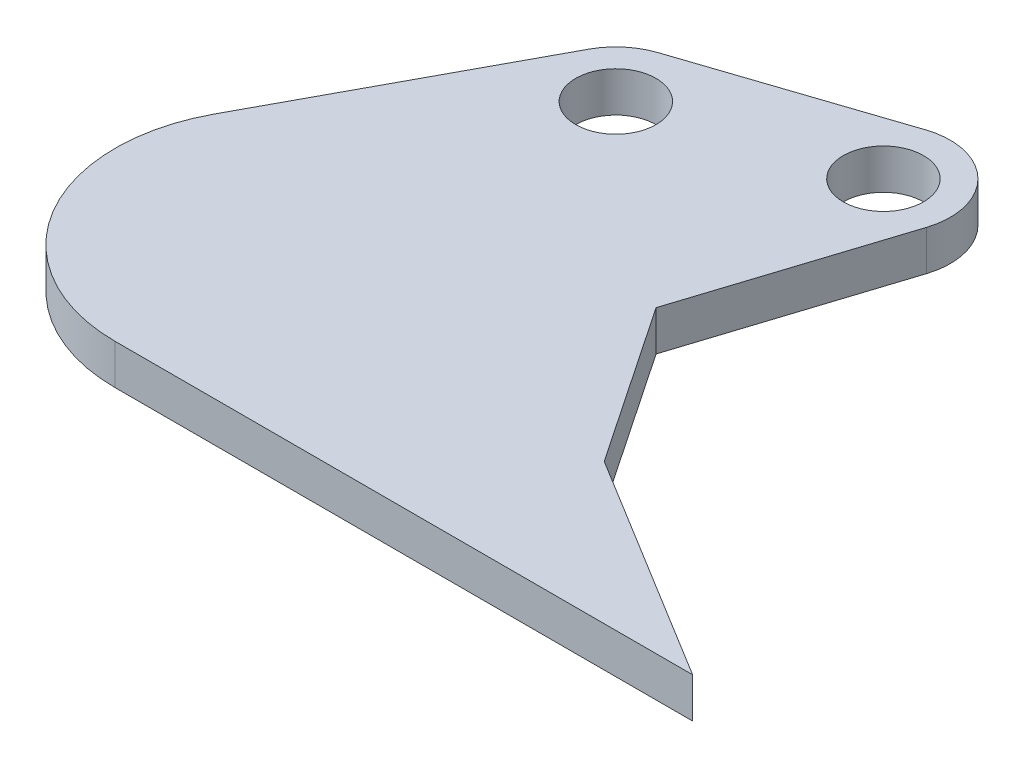
ISO-10303-21;
HEADER;
FILE_DESCRIPTION(('STEP AP214'),'2;1');
FILE_NAME('part.step','',(''),(''),'','','');
FILE_SCHEMA(('AUTOMOTIVE_DESIGN { 1 0 10303 214 1 1 1 1 }'));
ENDSEC;
DATA;
#1=APPLICATION_CONTEXT('core data for automotive mechanical design processes');
#2=APPLICATION_PROTOCOL_DEFINITION('international standard','automotive_design',2000,#1);
#3=PRODUCT_CONTEXT('',#1,'mechanical');
#4=PRODUCT('Part','Part','',(#3));
#5=PRODUCT_RELATED_PRODUCT_CATEGORY('part','',(#4));
#6=PRODUCT_DEFINITION_FORMATION('','',#4);
#7=PRODUCT_DEFINITION_CONTEXT('part definition',#1,'design');
#8=PRODUCT_DEFINITION('design','',#6,#7);
#9=PRODUCT_DEFINITION_SHAPE('','',#8);
#10=(LENGTH_UNIT() NAMED_UNIT(*) SI_UNIT(.MILLI.,.METRE.));
#11=(NAMED_UNIT(*) PLANE_ANGLE_UNIT() SI_UNIT($,.RADIAN.));
#12=(NAMED_UNIT(*) SI_UNIT($,.STERADIAN.) SOLID_ANGLE_UNIT());
#13=UNCERTAINTY_MEASURE_WITH_UNIT(LENGTH_MEASURE(1.E-05),#10,'distance_accuracy_value','');
#14=(GEOMETRIC_REPRESENTATION_CONTEXT(3) GLOBAL_UNCERTAINTY_ASSIGNED_CONTEXT((#13)) GLOBAL_UNIT_ASSIGNED_CONTEXT((#10,
#11,#12)) REPRESENTATION_CONTEXT('',''));
#15=CARTESIAN_POINT('',(0.,0.,0.));
#16=DIRECTION('',(0.,0.,1.));
#17=DIRECTION('',(1.,0.,0.));
#18=AXIS2_PLACEMENT_3D('',#15,#16,#17);
#19=CARTESIAN_POINT('',(-13.9441350903988,3.,-7.50787566868559));
#20=DIRECTION('',(0.880484404238511,0.,0.474075114188411));
#21=DIRECTION('',(0.474075114188411,0.,-0.880484404238511));
#22=AXIS2_PLACEMENT_3D('',#19,#20,#21);
#23=PLANE('',#22);
#24=DIRECTION('',(-0.474075114188411,0.,0.880484404238511));
#25=VECTOR('',#24,1.);
#26=CARTESIAN_POINT('',(-13.9441350903988,0.,-7.50787566868559));
#27=LINE('',#26,#25);
#28=CARTESIAN_POINT('',(-19.4024220211926,0.,2.62962442905794));
#29=VERTEX_POINT('',#28);
#30=CARTESIAN_POINT('',(-29.1939319779369,0.,20.8150797563611));
#31=VERTEX_POINT('',#30);
#32=EDGE_CURVE('E150',#29,#31,#27,.T.);
#33=ORIENTED_EDGE('',*,*,#32,.T.);
#34=DIRECTION('',(0.,-1.,0.));
#35=VECTOR('',#34,1.);
#36=CARTESIAN_POINT('',(-29.1939319779369,3.,20.8150797563611));
#37=LINE('',#36,#35);
#38=CARTESIAN_POINT('',(-29.1939319779369,3.,20.8150797563611));
#39=VERTEX_POINT('',#38);
#40=EDGE_CURVE('E11',#39,#31,#37,.T.);
#41=ORIENTED_EDGE('',*,*,#40,.F.);
#42=DIRECTION('',(-0.474075114188411,0.,0.880484404238511));
#43=VECTOR('',#42,1.);
#44=CARTESIAN_POINT('',(-13.9441350903988,3.,-7.50787566868559));
#45=LINE('',#44,#43);
#46=CARTESIAN_POINT('',(-19.4024220211926,3.,2.62962442905794));
#47=VERTEX_POINT('',#46);
#48=EDGE_CURVE('E176',#47,#39,#45,.T.);
#49=ORIENTED_EDGE('',*,*,#48,.F.);
#50=DIRECTION('',(0.,-1.,0.));
#51=VECTOR('',#50,1.);
#52=CARTESIAN_POINT('',(-19.4024220211926,3.,2.62962442905794));
#53=LINE('',#52,#51);
#54=EDGE_CURVE('E149',#47,#29,#53,.T.);
#55=ORIENTED_EDGE('',*,*,#54,.T.);
#56=EDGE_LOOP('',(#33,#41,#49,#55));
#57=FACE_BOUND('',#56,.T.);
#58=ADVANCED_FACE('F41',(#57),#23,.F.);
#59=CARTESIAN_POINT('',(-18.1878769249555,3.,26.7410186837162));
#60=DIRECTION('',(0.,-1.,0.));
#61=DIRECTION('',(0.,0.,-1.));
#62=AXIS2_PLACEMENT_3D('',#59,#60,#61);
#63=CYLINDRICAL_SURFACE('',#62,12.5);
#64=CARTESIAN_POINT('',(-18.1878769249555,0.,26.7410186837162));
#65=DIRECTION('',(0.,1.,0.));
#66=DIRECTION('',(0.,0.,1.));
#67=AXIS2_PLACEMENT_3D('',#64,#65,#66);
#68=CIRCLE('',#67,12.5);
#69=CARTESIAN_POINT('',(-18.1878769249555,0.,39.2410186837162));
#70=VERTEX_POINT('',#69);
#71=EDGE_CURVE('E153',#31,#70,#68,.T.);
#72=ORIENTED_EDGE('',*,*,#71,.T.);
#73=DIRECTION('',(0.,-1.,0.));
#74=VECTOR('',#73,1.);
#75=CARTESIAN_POINT('',(-18.1878769249555,3.,39.2410186837162));
#76=LINE('',#75,#74);
#77=CARTESIAN_POINT('',(-18.1878769249555,3.,39.2410186837162));
#78=VERTEX_POINT('',#77);
#79=EDGE_CURVE('E49',#78,#70,#76,.T.);
#80=ORIENTED_EDGE('',*,*,#79,.F.);
#81=CARTESIAN_POINT('',(-18.1878769249555,3.,26.7410186837162));
#82=DIRECTION('',(0.,1.,0.));
#83=DIRECTION('',(0.,0.,1.));
#84=AXIS2_PLACEMENT_3D('',#81,#82,#83);
#85=CIRCLE('',#84,12.5);
#86=EDGE_CURVE('E99',#39,#78,#85,.T.);
#87=ORIENTED_EDGE('',*,*,#86,.F.);
#88=ORIENTED_EDGE('',*,*,#40,.T.);
#89=EDGE_LOOP('',(#72,#80,#87,#88));
#90=FACE_BOUND('',#89,.T.);
#91=ADVANCED_FACE('F214',(#90),#63,.T.);
#92=CARTESIAN_POINT('',(0.,3.,39.2410186837162));
#93=DIRECTION('',(0.,0.,-1.));
#94=DIRECTION('',(-1.,0.,0.));
#95=AXIS2_PLACEMENT_3D('',#92,#93,#94);
#96=PLANE('',#95);
#97=DIRECTION('',(1.,0.,0.));
#98=VECTOR('',#97,1.);
#99=CARTESIAN_POINT('',(0.,0.,39.2410186837162));
#100=LINE('',#99,#98);
#101=CARTESIAN_POINT('',(24.9805666171507,0.,39.2410186837162));
#102=VERTEX_POINT('',#101);
#103=EDGE_CURVE('E155',#70,#102,#100,.T.);
#104=ORIENTED_EDGE('',*,*,#103,.T.);
#105=DIRECTION('',(0.,-1.,0.));
#106=VECTOR('',#105,1.);
#107=CARTESIAN_POINT('',(24.9805666171507,3.,39.2410186837162));
#108=LINE('',#107,#106);
#109=CARTESIAN_POINT('',(24.9805666171507,3.,39.2410186837162));
#110=VERTEX_POINT('',#109);
#111=EDGE_CURVE('E184',#110,#102,#108,.T.);
#112=ORIENTED_EDGE('',*,*,#111,.F.);
#113=DIRECTION('',(1.,0.,0.));
#114=VECTOR('',#113,1.);
#115=CARTESIAN_POINT('',(0.,3.,39.2410186837162));
#116=LINE('',#115,#114);
#117=EDGE_CURVE('E191',#78,#110,#116,.T.);
#118=ORIENTED_EDGE('',*,*,#117,.F.);
#119=ORIENTED_EDGE('',*,*,#79,.T.);
#120=EDGE_LOOP('',(#104,#112,#118,#119));
#121=FACE_BOUND('',#120,.T.);
#122=ADVANCED_FACE('F189',(#121),#96,.F.);
#123=CARTESIAN_POINT('',(-10.6586922843376,3.,17.3629679887185));
#124=DIRECTION('',(0.523163964597966,0.,-0.85223204947135));
#125=DIRECTION('',(-0.85223204947135,0.,-0.523163964597966));
#126=AXIS2_PLACEMENT_3D('',#123,#124,#125);
#127=PLANE('',#126);
#128=DIRECTION('',(0.85223204947135,0.,0.523163964597966));
#129=VECTOR('',#128,1.);
#130=CARTESIAN_POINT('',(-10.6586922843376,0.,17.3629679887185));
#131=LINE('',#130,#129);
#132=CARTESIAN_POINT('',(7.86365903530545,0.,28.7333767360448));
#133=VERTEX_POINT('',#132);
#134=EDGE_CURVE('E158',#133,#102,#131,.T.);
#135=ORIENTED_EDGE('',*,*,#134,.F.);
#136=DIRECTION('',(0.,-1.,0.));
#137=VECTOR('',#136,1.);
#138=CARTESIAN_POINT('',(7.86365903530545,3.,28.7333767360448));
#139=LINE('',#138,#137);
#140=CARTESIAN_POINT('',(7.86365903530545,3.,28.7333767360448));
#141=VERTEX_POINT('',#140);
#142=EDGE_CURVE('E182',#141,#133,#139,.T.);
#143=ORIENTED_EDGE('',*,*,#142,.F.);
#144=DIRECTION('',(0.85223204947135,0.,0.523163964597966));
#145=VECTOR('',#144,1.);
#146=CARTESIAN_POINT('',(-10.6586922843376,3.,17.3629679887185));
#147=LINE('',#146,#145);
#148=EDGE_CURVE('E203',#141,#110,#147,.T.);
#149=ORIENTED_EDGE('',*,*,#148,.T.);
#150=ORIENTED_EDGE('',*,*,#111,.T.);
#151=EDGE_LOOP('',(#135,#143,#149,#150));
#152=FACE_BOUND('',#151,.T.);
#153=ADVANCED_FACE('F200',(#152),#127,.T.);
#154=CARTESIAN_POINT('',(-7.90940999468469,3.,5.33086716399149));
#155=DIRECTION('',(0.829236661469017,0.,-0.558897628618801));
#156=DIRECTION('',(-0.558897628618801,0.,-0.829236661469017));
#157=AXIS2_PLACEMENT_3D('',#154,#155,#156);
#158=PLANE('',#157);
#159=DIRECTION('',(0.558897628618801,0.,0.829236661469017));
#160=VECTOR('',#159,1.);
#161=CARTESIAN_POINT('',(-7.90940999468469,0.,5.33086716399149));
#162=LINE('',#161,#160);
#163=CARTESIAN_POINT('',(-0.14994294070807,0.,16.8435919012923));
#164=VERTEX_POINT('',#163);
#165=EDGE_CURVE('E161',#164,#133,#162,.T.);
#166=ORIENTED_EDGE('',*,*,#165,.F.);
#167=DIRECTION('',(0.,-1.,0.));
#168=VECTOR('',#167,1.);
#169=CARTESIAN_POINT('',(-0.14994294070807,3.,16.8435919012923));
#170=LINE('',#169,#168);
#171=CARTESIAN_POINT('',(-0.14994294070807,3.,16.8435919012923));
#172=VERTEX_POINT('',#171);
#173=EDGE_CURVE('E180',#172,#164,#170,.T.);
#174=ORIENTED_EDGE('',*,*,#173,.F.);
#175=DIRECTION('',(0.558897628618801,0.,0.829236661469017));
#176=VECTOR('',#175,1.);
#177=CARTESIAN_POINT('',(-7.90940999468469,3.,5.33086716399149));
#178=LINE('',#177,#176);
#179=EDGE_CURVE('E205',#172,#141,#178,.T.);
#180=ORIENTED_EDGE('',*,*,#179,.T.);
#181=ORIENTED_EDGE('',*,*,#142,.T.);
#182=EDGE_LOOP('',(#166,#174,#180,#181));
#183=FACE_BOUND('',#182,.T.);
#184=ADVANCED_FACE('F224',(#183),#158,.T.);
#185=CARTESIAN_POINT('',(4.76123977347545,3.,1.52662890693038));
#186=DIRECTION('',(-0.95224795469509,0.,-0.305325781386075));
#187=DIRECTION('',(-0.305325781386075,0.,0.95224795469509));
#188=AXIS2_PLACEMENT_3D('',#185,#186,#187);
#189=PLANE('',#188);
#190=DIRECTION('',(0.305325781386075,0.,-0.95224795469509));
#191=VECTOR('',#190,1.);
#192=CARTESIAN_POINT('',(4.76123977347545,0.,1.52662890693038));
#193=LINE('',#192,#191);
#194=CARTESIAN_POINT('',(4.76123977347545,0.,1.52662890693038));
#195=VERTEX_POINT('',#194);
#196=EDGE_CURVE('E164',#164,#195,#193,.T.);
#197=ORIENTED_EDGE('',*,*,#196,.T.);
#198=DIRECTION('',(0.,-1.,0.));
#199=VECTOR('',#198,1.);
#200=CARTESIAN_POINT('',(4.76123977347545,3.,1.52662890693038));
#201=LINE('',#200,#199);
#202=CARTESIAN_POINT('',(4.76123977347545,3.,1.52662890693038));
#203=VERTEX_POINT('',#202);
#204=EDGE_CURVE('E136',#203,#195,#201,.T.);
#205=ORIENTED_EDGE('',*,*,#204,.F.);
#206=DIRECTION('',(0.305325781386075,0.,-0.95224795469509));
#207=VECTOR('',#206,1.);
#208=CARTESIAN_POINT('',(4.76123977347545,3.,1.52662890693038));
#209=LINE('',#208,#207);
#210=EDGE_CURVE('E123',#172,#203,#209,.T.);
#211=ORIENTED_EDGE('',*,*,#210,.F.);
#212=ORIENTED_EDGE('',*,*,#173,.T.);
#213=EDGE_LOOP('',(#197,#205,#211,#212));
#214=FACE_BOUND('',#213,.T.);
#215=ADVANCED_FACE('F227',(#214),#189,.F.);
#216=CARTESIAN_POINT('',(0.,3.,0.));
#217=DIRECTION('',(0.,-1.,0.));
#218=DIRECTION('',(0.,0.,-1.));
#219=AXIS2_PLACEMENT_3D('',#216,#217,#218);
#220=CYLINDRICAL_SURFACE('',#219,5.);
#221=CARTESIAN_POINT('',(0.,0.,0.));
#222=DIRECTION('',(0.,1.,0.));
#223=DIRECTION('',(0.,0.,1.));
#224=AXIS2_PLACEMENT_3D('',#221,#222,#223);
#225=CIRCLE('',#224,5.);
#226=CARTESIAN_POINT('',(-1.58113883008419,0.,-4.74341649025257));
#227=VERTEX_POINT('',#226);
#228=EDGE_CURVE('E132',#195,#227,#225,.T.);
#229=ORIENTED_EDGE('',*,*,#228,.T.);
#230=DIRECTION('',(0.,-1.,0.));
#231=VECTOR('',#230,1.);
#232=CARTESIAN_POINT('',(-1.58113883008419,3.,-4.74341649025257));
#233=LINE('',#232,#231);
#234=CARTESIAN_POINT('',(-1.58113883008419,3.,-4.74341649025257));
#235=VERTEX_POINT('',#234);
#236=EDGE_CURVE('E129',#235,#227,#233,.T.);
#237=ORIENTED_EDGE('',*,*,#236,.F.);
#238=CARTESIAN_POINT('',(0.,3.,0.));
#239=DIRECTION('',(0.,1.,0.));
#240=DIRECTION('',(0.,0.,1.));
#241=AXIS2_PLACEMENT_3D('',#238,#239,#240);
#242=CIRCLE('',#241,5.);
#243=EDGE_CURVE('E115',#203,#235,#242,.T.);
#244=ORIENTED_EDGE('',*,*,#243,.F.);
#245=ORIENTED_EDGE('',*,*,#204,.T.);
#246=EDGE_LOOP('',(#229,#237,#244,#245));
#247=FACE_BOUND('',#246,.T.);
#248=ADVANCED_FACE('F130',(#247),#220,.T.);
#249=CARTESIAN_POINT('',(-1.58113883008419,3.,-4.74341649025257));
#250=DIRECTION('',(-0.316227766016838,0.,-0.948683298050514));
#251=DIRECTION('',(-0.948683298050514,0.,0.316227766016838));
#252=AXIS2_PLACEMENT_3D('',#249,#250,#251);
#253=PLANE('',#252);
#254=DIRECTION('',(0.948683298050514,0.,-0.316227766016838));
#255=VECTOR('',#254,1.);
#256=CARTESIAN_POINT('',(-1.58113883008419,0.,-4.74341649025257));
#257=LINE('',#256,#255);
#258=CARTESIAN_POINT('',(-16.5811388300842,0.,0.25658350974743));
#259=VERTEX_POINT('',#258);
#260=EDGE_CURVE('E167',#259,#227,#257,.T.);
#261=ORIENTED_EDGE('',*,*,#260,.F.);
#262=DIRECTION('',(0.,-1.,0.));
#263=VECTOR('',#262,1.);
#264=CARTESIAN_POINT('',(-16.5811388300842,3.,0.25658350974743));
#265=LINE('',#264,#263);
#266=CARTESIAN_POINT('',(-16.5811388300842,3.,0.25658350974743));
#267=VERTEX_POINT('',#266);
#268=EDGE_CURVE('E88',#267,#259,#265,.T.);
#269=ORIENTED_EDGE('',*,*,#268,.F.);
#270=DIRECTION('',(0.948683298050514,0.,-0.316227766016838));
#271=VECTOR('',#270,1.);
#272=CARTESIAN_POINT('',(-1.58113883008419,3.,-4.74341649025257));
#273=LINE('',#272,#271);
#274=EDGE_CURVE('E120',#267,#235,#273,.T.);
#275=ORIENTED_EDGE('',*,*,#274,.T.);
#276=ORIENTED_EDGE('',*,*,#236,.T.);
#277=EDGE_LOOP('',(#261,#269,#275,#276));
#278=FACE_BOUND('',#277,.T.);
#279=ADVANCED_FACE('F138',(#278),#253,.T.);
#280=CARTESIAN_POINT('',(-15.,3.,5.));
#281=DIRECTION('',(0.,-1.,0.));
#282=DIRECTION('',(0.,0.,-1.));
#283=AXIS2_PLACEMENT_3D('',#280,#281,#282);
#284=CYLINDRICAL_SURFACE('',#283,3.);
#285=CARTESIAN_POINT('',(-15.,3.,5.));
#286=DIRECTION('',(0.,1.,0.));
#287=DIRECTION('',(0.,0.,1.));
#288=AXIS2_PLACEMENT_3D('',#285,#286,#287);
#289=CIRCLE('',#288,3.);
#290=CARTESIAN_POINT('',(-15.,3.,8.));
#291=VERTEX_POINT('',#290);
#292=EDGE_CURVE('E140',#291,#291,#289,.T.);
#293=ORIENTED_EDGE('',*,*,#292,.T.);
#294=EDGE_LOOP('',(#293));
#295=FACE_BOUND('',#294,.T.);
#296=CARTESIAN_POINT('',(-15.,0.,5.));
#297=DIRECTION('',(0.,1.,0.));
#298=DIRECTION('',(0.,0.,1.));
#299=AXIS2_PLACEMENT_3D('',#296,#297,#298);
#300=CIRCLE('',#299,3.);
#301=CARTESIAN_POINT('',(-15.,0.,8.));
#302=VERTEX_POINT('',#301);
#303=EDGE_CURVE('E170',#302,#302,#300,.T.);
#304=ORIENTED_EDGE('',*,*,#303,.F.);
#305=EDGE_LOOP('',(#304));
#306=FACE_BOUND('',#305,.T.);
#307=ADVANCED_FACE('F236',(#295,#306),#284,.F.);
#308=CARTESIAN_POINT('',(-15.,3.,5.));
#309=DIRECTION('',(0.,-1.,0.));
#310=DIRECTION('',(0.,0.,-1.));
#311=AXIS2_PLACEMENT_3D('',#308,#309,#310);
#312=CYLINDRICAL_SURFACE('',#311,5.);
#313=CARTESIAN_POINT('',(-15.,0.,5.));
#314=DIRECTION('',(0.,1.,0.));
#315=DIRECTION('',(0.,0.,1.));
#316=AXIS2_PLACEMENT_3D('',#313,#314,#315);
#317=CIRCLE('',#316,5.);
#318=EDGE_CURVE('E91',#259,#29,#317,.T.);
#319=ORIENTED_EDGE('',*,*,#318,.T.);
#320=ORIENTED_EDGE('',*,*,#54,.F.);
#321=CARTESIAN_POINT('',(-15.,3.,5.));
#322=DIRECTION('',(0.,1.,0.));
#323=DIRECTION('',(0.,0.,1.));
#324=AXIS2_PLACEMENT_3D('',#321,#322,#323);
#325=CIRCLE('',#324,5.);
#326=EDGE_CURVE('E57',#267,#47,#325,.T.);
#327=ORIENTED_EDGE('',*,*,#326,.F.);
#328=ORIENTED_EDGE('',*,*,#268,.T.);
#329=EDGE_LOOP('',(#319,#320,#327,#328));
#330=FACE_BOUND('',#329,.T.);
#331=ADVANCED_FACE('F237',(#330),#312,.T.);
#332=CARTESIAN_POINT('',(0.,3.,0.));
#333=DIRECTION('',(0.,-1.,0.));
#334=DIRECTION('',(0.,0.,-1.));
#335=AXIS2_PLACEMENT_3D('',#332,#333,#334);
#336=CYLINDRICAL_SURFACE('',#335,3.);
#337=CARTESIAN_POINT('',(0.,3.,0.));
#338=DIRECTION('',(0.,1.,0.));
#339=DIRECTION('',(0.,0.,1.));
#340=AXIS2_PLACEMENT_3D('',#337,#338,#339);
#341=CIRCLE('',#340,3.);
#342=CARTESIAN_POINT('',(0.,3.,3.));
#343=VERTEX_POINT('',#342);
#344=EDGE_CURVE('E146',#343,#343,#341,.T.);
#345=ORIENTED_EDGE('',*,*,#344,.T.);
#346=EDGE_LOOP('',(#345));
#347=FACE_BOUND('',#346,.T.);
#348=CARTESIAN_POINT('',(0.,0.,0.));
#349=DIRECTION('',(0.,1.,0.));
#350=DIRECTION('',(0.,0.,1.));
#351=AXIS2_PLACEMENT_3D('',#348,#349,#350);
#352=CIRCLE('',#351,3.);
#353=CARTESIAN_POINT('',(0.,0.,3.));
#354=VERTEX_POINT('',#353);
#355=EDGE_CURVE('E173',#354,#354,#352,.T.);
#356=ORIENTED_EDGE('',*,*,#355,.F.);
#357=EDGE_LOOP('',(#356));
#358=FACE_BOUND('',#357,.T.);
#359=ADVANCED_FACE('F240',(#347,#358),#336,.F.);
#360=CARTESIAN_POINT('',(0.,3.,0.));
#361=DIRECTION('',(0.,1.,0.));
#362=DIRECTION('',(0.,0.,1.));
#363=AXIS2_PLACEMENT_3D('',#360,#361,#362);
#364=PLANE('',#363);
#365=ORIENTED_EDGE('',*,*,#48,.T.);
#366=ORIENTED_EDGE('',*,*,#86,.T.);
#367=ORIENTED_EDGE('',*,*,#117,.T.);
#368=ORIENTED_EDGE('',*,*,#148,.F.);
#369=ORIENTED_EDGE('',*,*,#179,.F.);
#370=ORIENTED_EDGE('',*,*,#210,.T.);
#371=ORIENTED_EDGE('',*,*,#243,.T.);
#372=ORIENTED_EDGE('',*,*,#274,.F.);
#373=ORIENTED_EDGE('',*,*,#326,.T.);
#374=EDGE_LOOP('',(#365,#366,#367,#368,#369,#370,#371,#372,#373));
#375=FACE_BOUND('',#374,.T.);
#376=ORIENTED_EDGE('',*,*,#292,.F.);
#377=EDGE_LOOP('',(#376));
#378=FACE_BOUND('',#377,.T.);
#379=ORIENTED_EDGE('',*,*,#344,.F.);
#380=EDGE_LOOP('',(#379));
#381=FACE_BOUND('',#380,.T.);
#382=ADVANCED_FACE('F117',(#375,#378,#381),#364,.T.);
#383=CARTESIAN_POINT('',(0.,0.,0.));
#384=DIRECTION('',(0.,1.,0.));
#385=DIRECTION('',(0.,0.,1.));
#386=AXIS2_PLACEMENT_3D('',#383,#384,#385);
#387=PLANE('',#386);
#388=ORIENTED_EDGE('',*,*,#32,.F.);
#389=ORIENTED_EDGE('',*,*,#318,.F.);
#390=ORIENTED_EDGE('',*,*,#260,.T.);
#391=ORIENTED_EDGE('',*,*,#228,.F.);
#392=ORIENTED_EDGE('',*,*,#196,.F.);
#393=ORIENTED_EDGE('',*,*,#165,.T.);
#394=ORIENTED_EDGE('',*,*,#134,.T.);
#395=ORIENTED_EDGE('',*,*,#103,.F.);
#396=ORIENTED_EDGE('',*,*,#71,.F.);
#397=EDGE_LOOP('',(#388,#389,#390,#391,#392,#393,#394,#395,#396));
#398=FACE_BOUND('',#397,.T.);
#399=ORIENTED_EDGE('',*,*,#303,.T.);
#400=EDGE_LOOP('',(#399));
#401=FACE_BOUND('',#400,.T.);
#402=ORIENTED_EDGE('',*,*,#355,.T.);
#403=EDGE_LOOP('',(#402));
#404=FACE_BOUND('',#403,.T.);
#405=ADVANCED_FACE('F194',(#398,#401,#404),#387,.F.);
#406=CLOSED_SHELL('',(#58,#91,#122,#153,#184,#215,#248,#279,#307,#331,#359,#382,#405));
#407=MANIFOLD_SOLID_BREP('B2',#406);
#408=ADVANCED_BREP_SHAPE_REPRESENTATION('',(#18,#407),#14);
#409=SHAPE_DEFINITION_REPRESENTATION(#9,#408);
ENDSEC;
END-ISO-10303-21;
